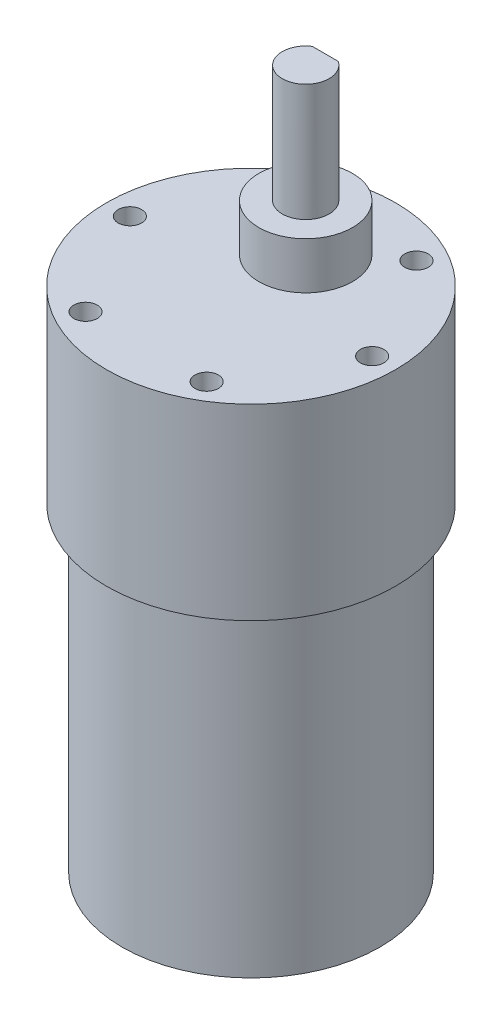
ISO-10303-21;
HEADER;
FILE_DESCRIPTION(('STEP AP214'),'2;1');
FILE_NAME('part.step','',(''),(''),'','','');
FILE_SCHEMA(('AUTOMOTIVE_DESIGN { 1 0 10303 214 1 1 1 1 }'));
ENDSEC;
DATA;
#1=APPLICATION_CONTEXT('core data for automotive mechanical design processes');
#2=APPLICATION_PROTOCOL_DEFINITION('international standard','automotive_design',2000,#1);
#3=PRODUCT_CONTEXT('',#1,'mechanical');
#4=PRODUCT('Part','Part','',(#3));
#5=PRODUCT_RELATED_PRODUCT_CATEGORY('part','',(#4));
#6=PRODUCT_DEFINITION_FORMATION('','',#4);
#7=PRODUCT_DEFINITION_CONTEXT('part definition',#1,'design');
#8=PRODUCT_DEFINITION('design','',#6,#7);
#9=PRODUCT_DEFINITION_SHAPE('','',#8);
#10=(LENGTH_UNIT() NAMED_UNIT(*) SI_UNIT(.MILLI.,.METRE.));
#11=(NAMED_UNIT(*) PLANE_ANGLE_UNIT() SI_UNIT($,.RADIAN.));
#12=(NAMED_UNIT(*) SI_UNIT($,.STERADIAN.) SOLID_ANGLE_UNIT());
#13=UNCERTAINTY_MEASURE_WITH_UNIT(LENGTH_MEASURE(1.E-05),#10,'distance_accuracy_value','');
#14=(GEOMETRIC_REPRESENTATION_CONTEXT(3) GLOBAL_UNCERTAINTY_ASSIGNED_CONTEXT((#13)) GLOBAL_UNIT_ASSIGNED_CONTEXT((#10,
#11,#12)) REPRESENTATION_CONTEXT('',''));
#15=CARTESIAN_POINT('',(0.,0.,0.));
#16=DIRECTION('',(0.,0.,1.));
#17=DIRECTION('',(1.,0.,0.));
#18=AXIS2_PLACEMENT_3D('',#15,#16,#17);
#19=CARTESIAN_POINT('',(0.,41.,0.));
#20=DIRECTION('',(0.,-1.,0.));
#21=DIRECTION('',(0.,0.,-1.));
#22=AXIS2_PLACEMENT_3D('',#19,#20,#21);
#23=CYLINDRICAL_SURFACE('',#22,16.5);
#24=CARTESIAN_POINT('',(0.,41.,0.));
#25=DIRECTION('',(0.,1.,0.));
#26=DIRECTION('',(0.,0.,1.));
#27=AXIS2_PLACEMENT_3D('',#24,#25,#26);
#28=CIRCLE('',#27,16.5);
#29=CARTESIAN_POINT('',(0.,41.,16.5));
#30=VERTEX_POINT('',#29);
#31=EDGE_CURVE('E73',#30,#30,#28,.T.);
#32=ORIENTED_EDGE('',*,*,#31,.F.);
#33=EDGE_LOOP('',(#32));
#34=FACE_BOUND('',#33,.T.);
#35=CARTESIAN_POINT('',(0.,0.,0.));
#36=DIRECTION('',(0.,1.,0.));
#37=DIRECTION('',(0.,0.,1.));
#38=AXIS2_PLACEMENT_3D('',#35,#36,#37);
#39=CIRCLE('',#38,16.5);
#40=CARTESIAN_POINT('',(0.,0.,16.5));
#41=VERTEX_POINT('',#40);
#42=EDGE_CURVE('E97',#41,#41,#39,.T.);
#43=ORIENTED_EDGE('',*,*,#42,.T.);
#44=EDGE_LOOP('',(#43));
#45=FACE_BOUND('',#44,.T.);
#46=ADVANCED_FACE('F44',(#34,#45),#23,.T.);
#47=CARTESIAN_POINT('',(0.,0.,0.));
#48=DIRECTION('',(0.,1.,0.));
#49=DIRECTION('',(0.,0.,1.));
#50=AXIS2_PLACEMENT_3D('',#47,#48,#49);
#51=PLANE('',#50);
#52=ORIENTED_EDGE('',*,*,#42,.F.);
#53=EDGE_LOOP('',(#52));
#54=FACE_BOUND('',#53,.T.);
#55=ADVANCED_FACE('F106',(#54),#51,.F.);
#56=CARTESIAN_POINT('',(0.,65.,0.));
#57=DIRECTION('',(0.,-1.,0.));
#58=DIRECTION('',(0.,0.,-1.));
#59=AXIS2_PLACEMENT_3D('',#56,#57,#58);
#60=CYLINDRICAL_SURFACE('',#59,18.5);
#61=CARTESIAN_POINT('',(0.,65.,0.));
#62=DIRECTION('',(0.,1.,0.));
#63=DIRECTION('',(0.,0.,1.));
#64=AXIS2_PLACEMENT_3D('',#61,#62,#63);
#65=CIRCLE('',#64,18.5);
#66=CARTESIAN_POINT('',(0.,65.,18.5));
#67=VERTEX_POINT('',#66);
#68=EDGE_CURVE('E94',#67,#67,#65,.T.);
#69=ORIENTED_EDGE('',*,*,#68,.F.);
#70=EDGE_LOOP('',(#69));
#71=FACE_BOUND('',#70,.T.);
#72=CARTESIAN_POINT('',(0.,41.,0.));
#73=DIRECTION('',(0.,1.,0.));
#74=DIRECTION('',(0.,0.,1.));
#75=AXIS2_PLACEMENT_3D('',#72,#73,#74);
#76=CIRCLE('',#75,18.5);
#77=CARTESIAN_POINT('',(0.,41.,18.5));
#78=VERTEX_POINT('',#77);
#79=EDGE_CURVE('E92',#78,#78,#76,.T.);
#80=ORIENTED_EDGE('',*,*,#79,.T.);
#81=EDGE_LOOP('',(#80));
#82=FACE_BOUND('',#81,.T.);
#83=ADVANCED_FACE('F108',(#71,#82),#60,.T.);
#84=CARTESIAN_POINT('',(0.,65.,0.));
#85=DIRECTION('',(0.,1.,0.));
#86=DIRECTION('',(0.,0.,1.));
#87=AXIS2_PLACEMENT_3D('',#84,#85,#86);
#88=PLANE('',#87);
#89=CARTESIAN_POINT('',(-7.74999999999997,65.,-13.4233937586588));
#90=DIRECTION('',(0.,1.,0.));
#91=DIRECTION('',(0.,0.,1.));
#92=AXIS2_PLACEMENT_3D('',#89,#90,#91);
#93=CIRCLE('',#92,1.5);
#94=CARTESIAN_POINT('',(-7.74999999999997,65.,-11.9233937586588));
#95=VERTEX_POINT('',#94);
#96=EDGE_CURVE('E196',#95,#95,#93,.T.);
#97=ORIENTED_EDGE('',*,*,#96,.F.);
#98=EDGE_LOOP('',(#97));
#99=FACE_BOUND('',#98,.T.);
#100=CARTESIAN_POINT('',(7.75000000000006,65.,-13.4233937586588));
#101=DIRECTION('',(0.,1.,0.));
#102=DIRECTION('',(0.,0.,1.));
#103=AXIS2_PLACEMENT_3D('',#100,#101,#102);
#104=CIRCLE('',#103,1.5);
#105=CARTESIAN_POINT('',(7.75000000000006,65.,-11.9233937586588));
#106=VERTEX_POINT('',#105);
#107=EDGE_CURVE('E207',#106,#106,#104,.T.);
#108=ORIENTED_EDGE('',*,*,#107,.F.);
#109=EDGE_LOOP('',(#108));
#110=FACE_BOUND('',#109,.T.);
#111=CARTESIAN_POINT('',(15.5,65.,1.08235921504137E-13));
#112=DIRECTION('',(0.,1.,0.));
#113=DIRECTION('',(0.,0.,1.));
#114=AXIS2_PLACEMENT_3D('',#111,#112,#113);
#115=CIRCLE('',#114,1.5);
#116=CARTESIAN_POINT('',(15.5,65.,1.50000000000011));
#117=VERTEX_POINT('',#116);
#118=EDGE_CURVE('E213',#117,#117,#115,.T.);
#119=ORIENTED_EDGE('',*,*,#118,.F.);
#120=EDGE_LOOP('',(#119));
#121=FACE_BOUND('',#120,.T.);
#122=CARTESIAN_POINT('',(7.74999999999987,65.,13.4233937586589));
#123=DIRECTION('',(0.,1.,0.));
#124=DIRECTION('',(0.,0.,1.));
#125=AXIS2_PLACEMENT_3D('',#122,#123,#124);
#126=CIRCLE('',#125,1.5);
#127=CARTESIAN_POINT('',(7.74999999999987,65.,14.9233937586589));
#128=VERTEX_POINT('',#127);
#129=EDGE_CURVE('E219',#128,#128,#126,.T.);
#130=ORIENTED_EDGE('',*,*,#129,.F.);
#131=EDGE_LOOP('',(#130));
#132=FACE_BOUND('',#131,.T.);
#133=CARTESIAN_POINT('',(-7.75000000000016,65.,13.4233937586587));
#134=DIRECTION('',(0.,1.,0.));
#135=DIRECTION('',(0.,0.,1.));
#136=AXIS2_PLACEMENT_3D('',#133,#134,#135);
#137=CIRCLE('',#136,1.5);
#138=CARTESIAN_POINT('',(-7.75000000000016,65.,14.9233937586587));
#139=VERTEX_POINT('',#138);
#140=EDGE_CURVE('E225',#139,#139,#137,.T.);
#141=ORIENTED_EDGE('',*,*,#140,.F.);
#142=EDGE_LOOP('',(#141));
#143=FACE_BOUND('',#142,.T.);
#144=CARTESIAN_POINT('',(-15.5,65.,0.));
#145=DIRECTION('',(0.,1.,0.));
#146=DIRECTION('',(0.,0.,1.));
#147=AXIS2_PLACEMENT_3D('',#144,#145,#146);
#148=CIRCLE('',#147,1.5);
#149=CARTESIAN_POINT('',(-15.5,65.,1.5));
#150=VERTEX_POINT('',#149);
#151=EDGE_CURVE('E195',#150,#150,#148,.T.);
#152=ORIENTED_EDGE('',*,*,#151,.F.);
#153=EDGE_LOOP('',(#152));
#154=FACE_BOUND('',#153,.T.);
#155=CARTESIAN_POINT('',(0.,65.,-7.));
#156=DIRECTION('',(0.,1.,0.));
#157=DIRECTION('',(0.,0.,1.));
#158=AXIS2_PLACEMENT_3D('',#155,#156,#157);
#159=CIRCLE('',#158,6.);
#160=CARTESIAN_POINT('',(0.,65.,-0.999999999999999));
#161=VERTEX_POINT('',#160);
#162=EDGE_CURVE('E81',#161,#161,#159,.T.);
#163=ORIENTED_EDGE('',*,*,#162,.F.);
#164=EDGE_LOOP('',(#163));
#165=FACE_BOUND('',#164,.T.);
#166=ORIENTED_EDGE('',*,*,#68,.T.);
#167=EDGE_LOOP('',(#166));
#168=FACE_BOUND('',#167,.T.);
#169=ADVANCED_FACE('F113',(#99,#110,#121,#132,#143,#154,#165,#168),#88,.T.);
#170=CARTESIAN_POINT('',(0.,41.,0.));
#171=DIRECTION('',(0.,1.,0.));
#172=DIRECTION('',(0.,0.,1.));
#173=AXIS2_PLACEMENT_3D('',#170,#171,#172);
#174=PLANE('',#173);
#175=ORIENTED_EDGE('',*,*,#31,.T.);
#176=EDGE_LOOP('',(#175));
#177=FACE_BOUND('',#176,.T.);
#178=ORIENTED_EDGE('',*,*,#79,.F.);
#179=EDGE_LOOP('',(#178));
#180=FACE_BOUND('',#179,.T.);
#181=ADVANCED_FACE('F118',(#177,#180),#174,.F.);
#182=CARTESIAN_POINT('',(0.,71.,-7.));
#183=DIRECTION('',(0.,-1.,0.));
#184=DIRECTION('',(0.,0.,-1.));
#185=AXIS2_PLACEMENT_3D('',#182,#183,#184);
#186=CYLINDRICAL_SURFACE('',#185,6.);
#187=CARTESIAN_POINT('',(0.,71.,-7.));
#188=DIRECTION('',(0.,1.,0.));
#189=DIRECTION('',(0.,0.,1.));
#190=AXIS2_PLACEMENT_3D('',#187,#188,#189);
#191=CIRCLE('',#190,6.);
#192=CARTESIAN_POINT('',(0.,71.,-0.999999999999999));
#193=VERTEX_POINT('',#192);
#194=EDGE_CURVE('E85',#193,#193,#191,.T.);
#195=ORIENTED_EDGE('',*,*,#194,.F.);
#196=EDGE_LOOP('',(#195));
#197=FACE_BOUND('',#196,.T.);
#198=ORIENTED_EDGE('',*,*,#162,.T.);
#199=EDGE_LOOP('',(#198));
#200=FACE_BOUND('',#199,.T.);
#201=ADVANCED_FACE('F121',(#197,#200),#186,.T.);
#202=CARTESIAN_POINT('',(0.,71.,-7.));
#203=DIRECTION('',(0.,1.,0.));
#204=DIRECTION('',(0.,0.,1.));
#205=AXIS2_PLACEMENT_3D('',#202,#203,#204);
#206=PLANE('',#205);
#207=CARTESIAN_POINT('',(0.,71.,-7.));
#208=DIRECTION('',(0.,1.,0.));
#209=DIRECTION('',(0.,0.,1.));
#210=AXIS2_PLACEMENT_3D('',#207,#208,#209);
#211=CIRCLE('',#210,3.);
#212=CARTESIAN_POINT('',(0.,71.,-4.));
#213=VERTEX_POINT('',#212);
#214=EDGE_CURVE('E82',#213,#213,#211,.T.);
#215=ORIENTED_EDGE('',*,*,#214,.F.);
#216=EDGE_LOOP('',(#215));
#217=FACE_BOUND('',#216,.T.);
#218=ORIENTED_EDGE('',*,*,#194,.T.);
#219=EDGE_LOOP('',(#218));
#220=FACE_BOUND('',#219,.T.);
#221=ADVANCED_FACE('F128',(#217,#220),#206,.T.);
#222=CARTESIAN_POINT('',(0.,86.,-7.));
#223=DIRECTION('',(0.,-1.,0.));
#224=DIRECTION('',(0.,0.,-1.));
#225=AXIS2_PLACEMENT_3D('',#222,#223,#224);
#226=CYLINDRICAL_SURFACE('',#225,3.);
#227=CARTESIAN_POINT('',(0.,86.,-7.));
#228=DIRECTION('',(0.,1.,0.));
#229=DIRECTION('',(0.,0.,1.));
#230=AXIS2_PLACEMENT_3D('',#227,#228,#229);
#231=CIRCLE('',#230,3.);
#232=CARTESIAN_POINT('',(-1.6583123951777,86.,-9.5));
#233=VERTEX_POINT('',#232);
#234=CARTESIAN_POINT('',(1.6583123951777,86.,-9.5));
#235=VERTEX_POINT('',#234);
#236=EDGE_CURVE('E77',#233,#235,#231,.T.);
#237=ORIENTED_EDGE('',*,*,#236,.F.);
#238=DIRECTION('',(0.,-1.,0.));
#239=VECTOR('',#238,1.);
#240=CARTESIAN_POINT('',(-1.6583123951777,86.,-9.5));
#241=LINE('',#240,#239);
#242=CARTESIAN_POINT('',(-1.6583123951777,74.,-9.5));
#243=VERTEX_POINT('',#242);
#244=EDGE_CURVE('E58',#233,#243,#241,.T.);
#245=ORIENTED_EDGE('',*,*,#244,.T.);
#246=CARTESIAN_POINT('',(0.,74.,-7.));
#247=DIRECTION('',(0.,-1.,0.));
#248=DIRECTION('',(0.,0.,-1.));
#249=AXIS2_PLACEMENT_3D('',#246,#247,#248);
#250=CIRCLE('',#249,3.);
#251=CARTESIAN_POINT('',(1.6583123951777,74.,-9.5));
#252=VERTEX_POINT('',#251);
#253=EDGE_CURVE('E13',#243,#252,#250,.T.);
#254=ORIENTED_EDGE('',*,*,#253,.T.);
#255=DIRECTION('',(0.,-1.,0.));
#256=VECTOR('',#255,1.);
#257=CARTESIAN_POINT('',(1.6583123951777,86.,-9.5));
#258=LINE('',#257,#256);
#259=EDGE_CURVE('E63',#252,#235,#258,.F.);
#260=ORIENTED_EDGE('',*,*,#259,.T.);
#261=EDGE_LOOP('',(#237,#245,#254,#260));
#262=FACE_BOUND('',#261,.T.);
#263=ORIENTED_EDGE('',*,*,#214,.T.);
#264=EDGE_LOOP('',(#263));
#265=FACE_BOUND('',#264,.T.);
#266=ADVANCED_FACE('F75',(#262,#265),#226,.T.);
#267=CARTESIAN_POINT('',(0.,86.,-7.));
#268=DIRECTION('',(0.,1.,0.));
#269=DIRECTION('',(0.,0.,1.));
#270=AXIS2_PLACEMENT_3D('',#267,#268,#269);
#271=PLANE('',#270);
#272=DIRECTION('',(1.,0.,0.));
#273=VECTOR('',#272,1.);
#274=CARTESIAN_POINT('',(0.,86.,-9.5));
#275=LINE('',#274,#273);
#276=EDGE_CURVE('E51',#233,#235,#275,.T.);
#277=ORIENTED_EDGE('',*,*,#276,.F.);
#278=ORIENTED_EDGE('',*,*,#236,.T.);
#279=EDGE_LOOP('',(#277,#278));
#280=FACE_BOUND('',#279,.T.);
#281=ADVANCED_FACE('F80',(#280),#271,.T.);
#282=CARTESIAN_POINT('',(0.,74.,0.));
#283=DIRECTION('',(0.,-1.,0.));
#284=DIRECTION('',(0.,0.,-1.));
#285=AXIS2_PLACEMENT_3D('',#282,#283,#284);
#286=PLANE('',#285);
#287=DIRECTION('',(1.,0.,0.));
#288=VECTOR('',#287,1.);
#289=CARTESIAN_POINT('',(-3.94189966427108,74.,-9.5));
#290=LINE('',#289,#288);
#291=EDGE_CURVE('E78',#243,#252,#290,.T.);
#292=ORIENTED_EDGE('',*,*,#291,.T.);
#293=ORIENTED_EDGE('',*,*,#253,.F.);
#294=EDGE_LOOP('',(#292,#293));
#295=FACE_BOUND('',#294,.T.);
#296=ADVANCED_FACE('F137',(#295),#286,.F.);
#297=CARTESIAN_POINT('',(-3.94189966427108,74.,-9.5));
#298=DIRECTION('',(0.,0.,1.));
#299=DIRECTION('',(1.,0.,0.));
#300=AXIS2_PLACEMENT_3D('',#297,#298,#299);
#301=PLANE('',#300);
#302=ORIENTED_EDGE('',*,*,#276,.T.);
#303=ORIENTED_EDGE('',*,*,#259,.F.);
#304=ORIENTED_EDGE('',*,*,#291,.F.);
#305=ORIENTED_EDGE('',*,*,#244,.F.);
#306=EDGE_LOOP('',(#302,#303,#304,#305));
#307=FACE_BOUND('',#306,.T.);
#308=ADVANCED_FACE('F69',(#307),#301,.F.);
#309=CARTESIAN_POINT('',(-15.5,62.,0.));
#310=DIRECTION('',(0.,1.,0.));
#311=DIRECTION('',(0.,0.,1.));
#312=AXIS2_PLACEMENT_3D('',#309,#310,#311);
#313=CYLINDRICAL_SURFACE('',#312,1.5);
#314=CARTESIAN_POINT('',(-15.5,62.,0.));
#315=DIRECTION('',(0.,1.,0.));
#316=DIRECTION('',(0.,0.,1.));
#317=AXIS2_PLACEMENT_3D('',#314,#315,#316);
#318=CIRCLE('',#317,1.5);
#319=CARTESIAN_POINT('',(-15.5,62.,1.5));
#320=VERTEX_POINT('',#319);
#321=EDGE_CURVE('E199',#320,#320,#318,.T.);
#322=ORIENTED_EDGE('',*,*,#321,.F.);
#323=EDGE_LOOP('',(#322));
#324=FACE_BOUND('',#323,.T.);
#325=ORIENTED_EDGE('',*,*,#151,.T.);
#326=EDGE_LOOP('',(#325));
#327=FACE_BOUND('',#326,.T.);
#328=ADVANCED_FACE('F140',(#324,#327),#313,.F.);
#329=CARTESIAN_POINT('',(-15.5,62.,0.));
#330=DIRECTION('',(0.,1.,0.));
#331=DIRECTION('',(0.,0.,1.));
#332=AXIS2_PLACEMENT_3D('',#329,#330,#331);
#333=PLANE('',#332);
#334=ORIENTED_EDGE('',*,*,#321,.T.);
#335=EDGE_LOOP('',(#334));
#336=FACE_BOUND('',#335,.T.);
#337=ADVANCED_FACE('F146',(#336),#333,.T.);
#338=CARTESIAN_POINT('',(-7.75000000000016,62.,13.4233937586587));
#339=DIRECTION('',(0.,1.,0.));
#340=DIRECTION('',(0.,0.,1.));
#341=AXIS2_PLACEMENT_3D('',#338,#339,#340);
#342=CYLINDRICAL_SURFACE('',#341,1.5);
#343=CARTESIAN_POINT('',(-7.75000000000016,62.,13.4233937586587));
#344=DIRECTION('',(0.,1.,0.));
#345=DIRECTION('',(0.,0.,1.));
#346=AXIS2_PLACEMENT_3D('',#343,#344,#345);
#347=CIRCLE('',#346,1.5);
#348=CARTESIAN_POINT('',(-7.75000000000016,62.,14.9233937586587));
#349=VERTEX_POINT('',#348);
#350=EDGE_CURVE('E222',#349,#349,#347,.T.);
#351=ORIENTED_EDGE('',*,*,#350,.F.);
#352=EDGE_LOOP('',(#351));
#353=FACE_BOUND('',#352,.T.);
#354=ORIENTED_EDGE('',*,*,#140,.T.);
#355=EDGE_LOOP('',(#354));
#356=FACE_BOUND('',#355,.T.);
#357=ADVANCED_FACE('F150',(#353,#356),#342,.F.);
#358=CARTESIAN_POINT('',(-7.75000000000016,62.,13.4233937586587));
#359=DIRECTION('',(0.,1.,0.));
#360=DIRECTION('',(0.,0.,1.));
#361=AXIS2_PLACEMENT_3D('',#358,#359,#360);
#362=PLANE('',#361);
#363=ORIENTED_EDGE('',*,*,#350,.T.);
#364=EDGE_LOOP('',(#363));
#365=FACE_BOUND('',#364,.T.);
#366=ADVANCED_FACE('F154',(#365),#362,.T.);
#367=CARTESIAN_POINT('',(7.74999999999987,62.,13.4233937586589));
#368=DIRECTION('',(0.,1.,0.));
#369=DIRECTION('',(0.,0.,1.));
#370=AXIS2_PLACEMENT_3D('',#367,#368,#369);
#371=CYLINDRICAL_SURFACE('',#370,1.5);
#372=CARTESIAN_POINT('',(7.74999999999987,62.,13.4233937586589));
#373=DIRECTION('',(0.,1.,0.));
#374=DIRECTION('',(0.,0.,1.));
#375=AXIS2_PLACEMENT_3D('',#372,#373,#374);
#376=CIRCLE('',#375,1.5);
#377=CARTESIAN_POINT('',(7.74999999999987,62.,14.9233937586589));
#378=VERTEX_POINT('',#377);
#379=EDGE_CURVE('E216',#378,#378,#376,.T.);
#380=ORIENTED_EDGE('',*,*,#379,.F.);
#381=EDGE_LOOP('',(#380));
#382=FACE_BOUND('',#381,.T.);
#383=ORIENTED_EDGE('',*,*,#129,.T.);
#384=EDGE_LOOP('',(#383));
#385=FACE_BOUND('',#384,.T.);
#386=ADVANCED_FACE('F158',(#382,#385),#371,.F.);
#387=CARTESIAN_POINT('',(7.74999999999987,62.,13.4233937586589));
#388=DIRECTION('',(0.,1.,0.));
#389=DIRECTION('',(0.,0.,1.));
#390=AXIS2_PLACEMENT_3D('',#387,#388,#389);
#391=PLANE('',#390);
#392=ORIENTED_EDGE('',*,*,#379,.T.);
#393=EDGE_LOOP('',(#392));
#394=FACE_BOUND('',#393,.T.);
#395=ADVANCED_FACE('F162',(#394),#391,.T.);
#396=CARTESIAN_POINT('',(15.5,62.,1.08235921504137E-13));
#397=DIRECTION('',(0.,1.,0.));
#398=DIRECTION('',(0.,0.,1.));
#399=AXIS2_PLACEMENT_3D('',#396,#397,#398);
#400=CYLINDRICAL_SURFACE('',#399,1.5);
#401=CARTESIAN_POINT('',(15.5,62.,1.08235921504137E-13));
#402=DIRECTION('',(0.,1.,0.));
#403=DIRECTION('',(0.,0.,1.));
#404=AXIS2_PLACEMENT_3D('',#401,#402,#403);
#405=CIRCLE('',#404,1.5);
#406=CARTESIAN_POINT('',(15.5,62.,1.50000000000011));
#407=VERTEX_POINT('',#406);
#408=EDGE_CURVE('E210',#407,#407,#405,.T.);
#409=ORIENTED_EDGE('',*,*,#408,.F.);
#410=EDGE_LOOP('',(#409));
#411=FACE_BOUND('',#410,.T.);
#412=ORIENTED_EDGE('',*,*,#118,.T.);
#413=EDGE_LOOP('',(#412));
#414=FACE_BOUND('',#413,.T.);
#415=ADVANCED_FACE('F166',(#411,#414),#400,.F.);
#416=CARTESIAN_POINT('',(15.5,62.,1.08235921504137E-13));
#417=DIRECTION('',(0.,1.,0.));
#418=DIRECTION('',(0.,0.,1.));
#419=AXIS2_PLACEMENT_3D('',#416,#417,#418);
#420=PLANE('',#419);
#421=ORIENTED_EDGE('',*,*,#408,.T.);
#422=EDGE_LOOP('',(#421));
#423=FACE_BOUND('',#422,.T.);
#424=ADVANCED_FACE('F170',(#423),#420,.T.);
#425=CARTESIAN_POINT('',(7.75000000000006,62.,-13.4233937586588));
#426=DIRECTION('',(0.,1.,0.));
#427=DIRECTION('',(0.,0.,1.));
#428=AXIS2_PLACEMENT_3D('',#425,#426,#427);
#429=CYLINDRICAL_SURFACE('',#428,1.5);
#430=CARTESIAN_POINT('',(7.75000000000006,62.,-13.4233937586588));
#431=DIRECTION('',(0.,1.,0.));
#432=DIRECTION('',(0.,0.,1.));
#433=AXIS2_PLACEMENT_3D('',#430,#431,#432);
#434=CIRCLE('',#433,1.5);
#435=CARTESIAN_POINT('',(7.75000000000006,62.,-11.9233937586588));
#436=VERTEX_POINT('',#435);
#437=EDGE_CURVE('E202',#436,#436,#434,.T.);
#438=ORIENTED_EDGE('',*,*,#437,.F.);
#439=EDGE_LOOP('',(#438));
#440=FACE_BOUND('',#439,.T.);
#441=ORIENTED_EDGE('',*,*,#107,.T.);
#442=EDGE_LOOP('',(#441));
#443=FACE_BOUND('',#442,.T.);
#444=ADVANCED_FACE('F174',(#440,#443),#429,.F.);
#445=CARTESIAN_POINT('',(7.75000000000006,62.,-13.4233937586588));
#446=DIRECTION('',(0.,1.,0.));
#447=DIRECTION('',(0.,0.,1.));
#448=AXIS2_PLACEMENT_3D('',#445,#446,#447);
#449=PLANE('',#448);
#450=ORIENTED_EDGE('',*,*,#437,.T.);
#451=EDGE_LOOP('',(#450));
#452=FACE_BOUND('',#451,.T.);
#453=ADVANCED_FACE('F178',(#452),#449,.T.);
#454=CARTESIAN_POINT('',(-7.74999999999997,62.,-13.4233937586588));
#455=DIRECTION('',(0.,1.,0.));
#456=DIRECTION('',(0.,0.,1.));
#457=AXIS2_PLACEMENT_3D('',#454,#455,#456);
#458=CYLINDRICAL_SURFACE('',#457,1.5);
#459=CARTESIAN_POINT('',(-7.74999999999997,62.,-13.4233937586588));
#460=DIRECTION('',(0.,1.,0.));
#461=DIRECTION('',(0.,0.,1.));
#462=AXIS2_PLACEMENT_3D('',#459,#460,#461);
#463=CIRCLE('',#462,1.5);
#464=CARTESIAN_POINT('',(-7.74999999999997,62.,-11.9233937586588));
#465=VERTEX_POINT('',#464);
#466=EDGE_CURVE('E194',#465,#465,#463,.T.);
#467=ORIENTED_EDGE('',*,*,#466,.F.);
#468=EDGE_LOOP('',(#467));
#469=FACE_BOUND('',#468,.T.);
#470=ORIENTED_EDGE('',*,*,#96,.T.);
#471=EDGE_LOOP('',(#470));
#472=FACE_BOUND('',#471,.T.);
#473=ADVANCED_FACE('F182',(#469,#472),#458,.F.);
#474=CARTESIAN_POINT('',(-7.74999999999997,62.,-13.4233937586588));
#475=DIRECTION('',(0.,1.,0.));
#476=DIRECTION('',(0.,0.,1.));
#477=AXIS2_PLACEMENT_3D('',#474,#475,#476);
#478=PLANE('',#477);
#479=ORIENTED_EDGE('',*,*,#466,.T.);
#480=EDGE_LOOP('',(#479));
#481=FACE_BOUND('',#480,.T.);
#482=ADVANCED_FACE('F186',(#481),#478,.T.);
#483=CLOSED_SHELL('',(#46,#55,#83,#169,#181,#201,#221,#266,#281,#296,#308,#328,#337,#357,#366,
#386,#395,#415,#424,#444,#453,#473,#482));
#484=MANIFOLD_SOLID_BREP('B2',#483);
#485=ADVANCED_BREP_SHAPE_REPRESENTATION('',(#18,#484),#14);
#486=SHAPE_DEFINITION_REPRESENTATION(#9,#485);
ENDSEC;
END-ISO-10303-21;
